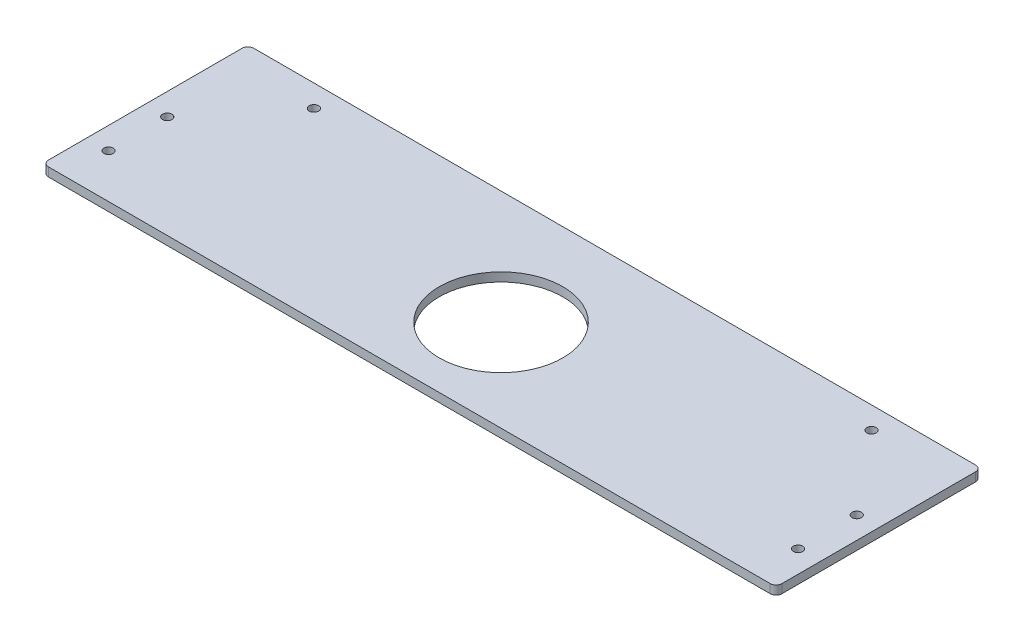
ISO-10303-21;
HEADER;
FILE_DESCRIPTION(('STEP AP214'),'2;1');
FILE_NAME('part.step','',(''),(''),'','','');
FILE_SCHEMA(('AUTOMOTIVE_DESIGN { 1 0 10303 214 1 1 1 1 }'));
ENDSEC;
DATA;
#1=APPLICATION_CONTEXT('core data for automotive mechanical design processes');
#2=APPLICATION_PROTOCOL_DEFINITION('international standard','automotive_design',2000,#1);
#3=PRODUCT_CONTEXT('',#1,'mechanical');
#4=PRODUCT('Part','Part','',(#3));
#5=PRODUCT_RELATED_PRODUCT_CATEGORY('part','',(#4));
#6=PRODUCT_DEFINITION_FORMATION('','',#4);
#7=PRODUCT_DEFINITION_CONTEXT('part definition',#1,'design');
#8=PRODUCT_DEFINITION('design','',#6,#7);
#9=PRODUCT_DEFINITION_SHAPE('','',#8);
#10=(LENGTH_UNIT() NAMED_UNIT(*) SI_UNIT(.MILLI.,.METRE.));
#11=(NAMED_UNIT(*) PLANE_ANGLE_UNIT() SI_UNIT($,.RADIAN.));
#12=(NAMED_UNIT(*) SI_UNIT($,.STERADIAN.) SOLID_ANGLE_UNIT());
#13=UNCERTAINTY_MEASURE_WITH_UNIT(LENGTH_MEASURE(1.E-05),#10,'distance_accuracy_value','');
#14=(GEOMETRIC_REPRESENTATION_CONTEXT(3) GLOBAL_UNCERTAINTY_ASSIGNED_CONTEXT((#13)) GLOBAL_UNIT_ASSIGNED_CONTEXT((#10,
#11,#12)) REPRESENTATION_CONTEXT('',''));
#15=CARTESIAN_POINT('',(0.,0.,0.));
#16=DIRECTION('',(0.,0.,1.));
#17=DIRECTION('',(1.,0.,0.));
#18=AXIS2_PLACEMENT_3D('',#15,#16,#17);
#19=CARTESIAN_POINT('',(125.,3.,35.));
#20=DIRECTION('',(-1.,0.,0.));
#21=DIRECTION('',(0.,0.,1.));
#22=AXIS2_PLACEMENT_3D('',#19,#20,#21);
#23=PLANE('',#22);
#24=DIRECTION('',(0.,0.,-1.));
#25=VECTOR('',#24,1.);
#26=CARTESIAN_POINT('',(125.,3.,35.));
#27=LINE('',#26,#25);
#28=CARTESIAN_POINT('',(125.,3.,33.));
#29=VERTEX_POINT('',#28);
#30=CARTESIAN_POINT('',(125.,3.,-33.));
#31=VERTEX_POINT('',#30);
#32=EDGE_CURVE('E125',#29,#31,#27,.T.);
#33=ORIENTED_EDGE('',*,*,#32,.F.);
#34=DIRECTION('',(0.,-1.,0.));
#35=VECTOR('',#34,1.);
#36=CARTESIAN_POINT('',(125.,3.,33.));
#37=LINE('',#36,#35);
#38=CARTESIAN_POINT('',(125.,0.,33.));
#39=VERTEX_POINT('',#38);
#40=EDGE_CURVE('E110',#29,#39,#37,.T.);
#41=ORIENTED_EDGE('',*,*,#40,.T.);
#42=DIRECTION('',(0.,0.,-1.));
#43=VECTOR('',#42,1.);
#44=CARTESIAN_POINT('',(125.,0.,35.));
#45=LINE('',#44,#43);
#46=CARTESIAN_POINT('',(125.,0.,-33.));
#47=VERTEX_POINT('',#46);
#48=EDGE_CURVE('E122',#39,#47,#45,.T.);
#49=ORIENTED_EDGE('',*,*,#48,.T.);
#50=DIRECTION('',(0.,-1.,0.));
#51=VECTOR('',#50,1.);
#52=CARTESIAN_POINT('',(125.,3.,-33.));
#53=LINE('',#52,#51);
#54=EDGE_CURVE('E127',#47,#31,#53,.F.);
#55=ORIENTED_EDGE('',*,*,#54,.T.);
#56=EDGE_LOOP('',(#33,#41,#49,#55));
#57=FACE_BOUND('',#56,.T.);
#58=ADVANCED_FACE('F41',(#57),#23,.F.);
#59=CARTESIAN_POINT('',(-125.,3.,-35.));
#60=DIRECTION('',(0.,0.,1.));
#61=DIRECTION('',(1.,0.,0.));
#62=AXIS2_PLACEMENT_3D('',#59,#60,#61);
#63=PLANE('',#62);
#64=DIRECTION('',(-1.,0.,0.));
#65=VECTOR('',#64,1.);
#66=CARTESIAN_POINT('',(-125.,3.,-35.));
#67=LINE('',#66,#65);
#68=CARTESIAN_POINT('',(123.,3.,-35.));
#69=VERTEX_POINT('',#68);
#70=CARTESIAN_POINT('',(-123.,3.,-35.));
#71=VERTEX_POINT('',#70);
#72=EDGE_CURVE('E180',#69,#71,#67,.T.);
#73=ORIENTED_EDGE('',*,*,#72,.F.);
#74=DIRECTION('',(0.,-1.,0.));
#75=VECTOR('',#74,1.);
#76=CARTESIAN_POINT('',(123.,3.,-35.));
#77=LINE('',#76,#75);
#78=CARTESIAN_POINT('',(123.,0.,-35.));
#79=VERTEX_POINT('',#78);
#80=EDGE_CURVE('E164',#69,#79,#77,.T.);
#81=ORIENTED_EDGE('',*,*,#80,.T.);
#82=DIRECTION('',(-1.,0.,0.));
#83=VECTOR('',#82,1.);
#84=CARTESIAN_POINT('',(-125.,0.,-35.));
#85=LINE('',#84,#83);
#86=CARTESIAN_POINT('',(-123.,0.,-35.));
#87=VERTEX_POINT('',#86);
#88=EDGE_CURVE('E131',#79,#87,#85,.T.);
#89=ORIENTED_EDGE('',*,*,#88,.T.);
#90=DIRECTION('',(0.,-1.,0.));
#91=VECTOR('',#90,1.);
#92=CARTESIAN_POINT('',(-123.,3.,-35.));
#93=LINE('',#92,#91);
#94=EDGE_CURVE('E162',#87,#71,#93,.F.);
#95=ORIENTED_EDGE('',*,*,#94,.T.);
#96=EDGE_LOOP('',(#73,#81,#89,#95));
#97=FACE_BOUND('',#96,.T.);
#98=ADVANCED_FACE('F263',(#97),#63,.F.);
#99=CARTESIAN_POINT('',(-125.,3.,35.));
#100=DIRECTION('',(1.,0.,0.));
#101=DIRECTION('',(0.,0.,-1.));
#102=AXIS2_PLACEMENT_3D('',#99,#100,#101);
#103=PLANE('',#102);
#104=DIRECTION('',(0.,0.,1.));
#105=VECTOR('',#104,1.);
#106=CARTESIAN_POINT('',(-125.,0.,35.));
#107=LINE('',#106,#105);
#108=CARTESIAN_POINT('',(-125.,0.,-33.));
#109=VERTEX_POINT('',#108);
#110=CARTESIAN_POINT('',(-125.,0.,33.));
#111=VERTEX_POINT('',#110);
#112=EDGE_CURVE('E135',#109,#111,#107,.T.);
#113=ORIENTED_EDGE('',*,*,#112,.T.);
#114=DIRECTION('',(0.,-1.,0.));
#115=VECTOR('',#114,1.);
#116=CARTESIAN_POINT('',(-125.,3.,33.));
#117=LINE('',#116,#115);
#118=CARTESIAN_POINT('',(-125.,3.,33.));
#119=VERTEX_POINT('',#118);
#120=EDGE_CURVE('E11',#111,#119,#117,.F.);
#121=ORIENTED_EDGE('',*,*,#120,.T.);
#122=DIRECTION('',(0.,0.,1.));
#123=VECTOR('',#122,1.);
#124=CARTESIAN_POINT('',(-125.,3.,35.));
#125=LINE('',#124,#123);
#126=CARTESIAN_POINT('',(-125.,3.,-33.));
#127=VERTEX_POINT('',#126);
#128=EDGE_CURVE('E170',#127,#119,#125,.T.);
#129=ORIENTED_EDGE('',*,*,#128,.F.);
#130=DIRECTION('',(0.,-1.,0.));
#131=VECTOR('',#130,1.);
#132=CARTESIAN_POINT('',(-125.,3.,-33.));
#133=LINE('',#132,#131);
#134=EDGE_CURVE('E49',#127,#109,#133,.T.);
#135=ORIENTED_EDGE('',*,*,#134,.T.);
#136=EDGE_LOOP('',(#113,#121,#129,#135));
#137=FACE_BOUND('',#136,.T.);
#138=ADVANCED_FACE('F169',(#137),#103,.F.);
#139=CARTESIAN_POINT('',(-125.,3.,35.));
#140=DIRECTION('',(0.,0.,-1.));
#141=DIRECTION('',(-1.,0.,0.));
#142=AXIS2_PLACEMENT_3D('',#139,#140,#141);
#143=PLANE('',#142);
#144=DIRECTION('',(1.,0.,0.));
#145=VECTOR('',#144,1.);
#146=CARTESIAN_POINT('',(-125.,0.,35.));
#147=LINE('',#146,#145);
#148=CARTESIAN_POINT('',(-123.,0.,35.));
#149=VERTEX_POINT('',#148);
#150=CARTESIAN_POINT('',(123.,0.,35.));
#151=VERTEX_POINT('',#150);
#152=EDGE_CURVE('E145',#149,#151,#147,.T.);
#153=ORIENTED_EDGE('',*,*,#152,.T.);
#154=DIRECTION('',(0.,-1.,0.));
#155=VECTOR('',#154,1.);
#156=CARTESIAN_POINT('',(123.,3.,35.));
#157=LINE('',#156,#155);
#158=CARTESIAN_POINT('',(123.,3.,35.));
#159=VERTEX_POINT('',#158);
#160=EDGE_CURVE('E111',#151,#159,#157,.F.);
#161=ORIENTED_EDGE('',*,*,#160,.T.);
#162=DIRECTION('',(1.,0.,0.));
#163=VECTOR('',#162,1.);
#164=CARTESIAN_POINT('',(-125.,3.,35.));
#165=LINE('',#164,#163);
#166=CARTESIAN_POINT('',(-123.,3.,35.));
#167=VERTEX_POINT('',#166);
#168=EDGE_CURVE('E141',#167,#159,#165,.T.);
#169=ORIENTED_EDGE('',*,*,#168,.F.);
#170=DIRECTION('',(0.,-1.,0.));
#171=VECTOR('',#170,1.);
#172=CARTESIAN_POINT('',(-123.,3.,35.));
#173=LINE('',#172,#171);
#174=EDGE_CURVE('E116',#167,#149,#173,.T.);
#175=ORIENTED_EDGE('',*,*,#174,.T.);
#176=EDGE_LOOP('',(#153,#161,#169,#175));
#177=FACE_BOUND('',#176,.T.);
#178=ADVANCED_FACE('F178',(#177),#143,.F.);
#179=CARTESIAN_POINT('',(0.,3.,0.));
#180=DIRECTION('',(0.,-1.,0.));
#181=DIRECTION('',(0.,0.,-1.));
#182=AXIS2_PLACEMENT_3D('',#179,#180,#181);
#183=PLANE('',#182);
#184=CARTESIAN_POINT('',(0.,3.,3.74999999999998));
#185=DIRECTION('',(0.,1.,0.));
#186=DIRECTION('',(0.,0.,1.));
#187=AXIS2_PLACEMENT_3D('',#184,#185,#186);
#188=CIRCLE('',#187,21.05);
#189=CARTESIAN_POINT('',(0.,3.,24.8));
#190=VERTEX_POINT('',#189);
#191=EDGE_CURVE('E217',#190,#190,#188,.T.);
#192=ORIENTED_EDGE('',*,*,#191,.F.);
#193=EDGE_LOOP('',(#192));
#194=FACE_BOUND('',#193,.T.);
#195=CARTESIAN_POINT('',(95.,3.,-27.5));
#196=DIRECTION('',(0.,1.,0.));
#197=DIRECTION('',(0.,0.,1.));
#198=AXIS2_PLACEMENT_3D('',#195,#196,#197);
#199=CIRCLE('',#198,1.6);
#200=CARTESIAN_POINT('',(95.,3.,-25.9));
#201=VERTEX_POINT('',#200);
#202=EDGE_CURVE('E185',#201,#201,#199,.T.);
#203=ORIENTED_EDGE('',*,*,#202,.F.);
#204=EDGE_LOOP('',(#203));
#205=FACE_BOUND('',#204,.T.);
#206=CARTESIAN_POINT('',(-117.5,3.,0.));
#207=DIRECTION('',(0.,1.,0.));
#208=DIRECTION('',(0.,0.,1.));
#209=AXIS2_PLACEMENT_3D('',#206,#207,#208);
#210=CIRCLE('',#209,1.60000000000001);
#211=CARTESIAN_POINT('',(-117.5,3.,1.60000000000001));
#212=VERTEX_POINT('',#211);
#213=EDGE_CURVE('E203',#212,#212,#210,.T.);
#214=ORIENTED_EDGE('',*,*,#213,.F.);
#215=EDGE_LOOP('',(#214));
#216=FACE_BOUND('',#215,.T.);
#217=CARTESIAN_POINT('',(-117.5,3.,20.));
#218=DIRECTION('',(0.,1.,0.));
#219=DIRECTION('',(0.,0.,1.));
#220=AXIS2_PLACEMENT_3D('',#217,#218,#219);
#221=CIRCLE('',#220,1.6);
#222=CARTESIAN_POINT('',(-117.5,3.,21.6));
#223=VERTEX_POINT('',#222);
#224=EDGE_CURVE('E197',#223,#223,#221,.T.);
#225=ORIENTED_EDGE('',*,*,#224,.F.);
#226=EDGE_LOOP('',(#225));
#227=FACE_BOUND('',#226,.T.);
#228=CARTESIAN_POINT('',(117.5,3.,20.));
#229=DIRECTION('',(0.,1.,0.));
#230=DIRECTION('',(0.,0.,-1.));
#231=AXIS2_PLACEMENT_3D('',#228,#229,#230);
#232=CIRCLE('',#231,1.6);
#233=CARTESIAN_POINT('',(117.5,3.,18.4));
#234=VERTEX_POINT('',#233);
#235=EDGE_CURVE('E190',#234,#234,#232,.T.);
#236=ORIENTED_EDGE('',*,*,#235,.F.);
#237=EDGE_LOOP('',(#236));
#238=FACE_BOUND('',#237,.T.);
#239=CARTESIAN_POINT('',(117.5,3.,0.));
#240=DIRECTION('',(0.,1.,0.));
#241=DIRECTION('',(0.,0.,-1.));
#242=AXIS2_PLACEMENT_3D('',#239,#240,#241);
#243=CIRCLE('',#242,1.60000000000001);
#244=CARTESIAN_POINT('',(117.5,3.,-1.60000000000003));
#245=VERTEX_POINT('',#244);
#246=EDGE_CURVE('E191',#245,#245,#243,.T.);
#247=ORIENTED_EDGE('',*,*,#246,.F.);
#248=EDGE_LOOP('',(#247));
#249=FACE_BOUND('',#248,.T.);
#250=CARTESIAN_POINT('',(-95.,3.,-27.5));
#251=DIRECTION('',(0.,1.,0.));
#252=DIRECTION('',(0.,0.,1.));
#253=AXIS2_PLACEMENT_3D('',#250,#251,#252);
#254=CIRCLE('',#253,1.6);
#255=CARTESIAN_POINT('',(-95.,3.,-25.9));
#256=VERTEX_POINT('',#255);
#257=EDGE_CURVE('E138',#256,#256,#254,.T.);
#258=ORIENTED_EDGE('',*,*,#257,.F.);
#259=EDGE_LOOP('',(#258));
#260=FACE_BOUND('',#259,.T.);
#261=ORIENTED_EDGE('',*,*,#168,.T.);
#262=CARTESIAN_POINT('',(123.,3.,33.));
#263=DIRECTION('',(0.,-1.,0.));
#264=DIRECTION('',(0.,0.,-1.));
#265=AXIS2_PLACEMENT_3D('',#262,#263,#264);
#266=CIRCLE('',#265,2.);
#267=EDGE_CURVE('E160',#159,#29,#266,.F.);
#268=ORIENTED_EDGE('',*,*,#267,.T.);
#269=ORIENTED_EDGE('',*,*,#32,.T.);
#270=CARTESIAN_POINT('',(123.,3.,-33.));
#271=DIRECTION('',(0.,-1.,0.));
#272=DIRECTION('',(0.,0.,-1.));
#273=AXIS2_PLACEMENT_3D('',#270,#271,#272);
#274=CIRCLE('',#273,2.);
#275=EDGE_CURVE('E158',#31,#69,#274,.F.);
#276=ORIENTED_EDGE('',*,*,#275,.T.);
#277=ORIENTED_EDGE('',*,*,#72,.T.);
#278=CARTESIAN_POINT('',(-123.,3.,-33.));
#279=DIRECTION('',(0.,-1.,0.));
#280=DIRECTION('',(0.,0.,-1.));
#281=AXIS2_PLACEMENT_3D('',#278,#279,#280);
#282=CIRCLE('',#281,2.);
#283=EDGE_CURVE('E61',#71,#127,#282,.F.);
#284=ORIENTED_EDGE('',*,*,#283,.T.);
#285=ORIENTED_EDGE('',*,*,#128,.T.);
#286=CARTESIAN_POINT('',(-123.,3.,33.));
#287=DIRECTION('',(0.,-1.,0.));
#288=DIRECTION('',(0.,0.,-1.));
#289=AXIS2_PLACEMENT_3D('',#286,#287,#288);
#290=CIRCLE('',#289,2.);
#291=EDGE_CURVE('E156',#119,#167,#290,.F.);
#292=ORIENTED_EDGE('',*,*,#291,.T.);
#293=EDGE_LOOP('',(#261,#268,#269,#276,#277,#284,#285,#292));
#294=FACE_BOUND('',#293,.T.);
#295=ADVANCED_FACE('F231',(#194,#205,#216,#227,#238,#249,#260,#294),#183,.F.);
#296=CARTESIAN_POINT('',(0.,0.,0.));
#297=DIRECTION('',(0.,-1.,0.));
#298=DIRECTION('',(0.,0.,-1.));
#299=AXIS2_PLACEMENT_3D('',#296,#297,#298);
#300=PLANE('',#299);
#301=CARTESIAN_POINT('',(0.,0.,3.74999999999998));
#302=DIRECTION('',(0.,1.,0.));
#303=DIRECTION('',(0.,0.,1.));
#304=AXIS2_PLACEMENT_3D('',#301,#302,#303);
#305=CIRCLE('',#304,21.05);
#306=CARTESIAN_POINT('',(0.,0.,24.8));
#307=VERTEX_POINT('',#306);
#308=EDGE_CURVE('E214',#307,#307,#305,.T.);
#309=ORIENTED_EDGE('',*,*,#308,.T.);
#310=EDGE_LOOP('',(#309));
#311=FACE_BOUND('',#310,.T.);
#312=CARTESIAN_POINT('',(95.,0.,-27.5));
#313=DIRECTION('',(0.,1.,0.));
#314=DIRECTION('',(0.,0.,1.));
#315=AXIS2_PLACEMENT_3D('',#312,#313,#314);
#316=CIRCLE('',#315,1.6);
#317=CARTESIAN_POINT('',(95.,0.,-25.9));
#318=VERTEX_POINT('',#317);
#319=EDGE_CURVE('E206',#318,#318,#316,.T.);
#320=ORIENTED_EDGE('',*,*,#319,.T.);
#321=EDGE_LOOP('',(#320));
#322=FACE_BOUND('',#321,.T.);
#323=CARTESIAN_POINT('',(-117.5,0.,0.));
#324=DIRECTION('',(0.,1.,0.));
#325=DIRECTION('',(0.,0.,1.));
#326=AXIS2_PLACEMENT_3D('',#323,#324,#325);
#327=CIRCLE('',#326,1.60000000000001);
#328=CARTESIAN_POINT('',(-117.5,0.,1.60000000000001));
#329=VERTEX_POINT('',#328);
#330=EDGE_CURVE('E200',#329,#329,#327,.T.);
#331=ORIENTED_EDGE('',*,*,#330,.T.);
#332=EDGE_LOOP('',(#331));
#333=FACE_BOUND('',#332,.T.);
#334=CARTESIAN_POINT('',(-117.5,0.,20.));
#335=DIRECTION('',(0.,1.,0.));
#336=DIRECTION('',(0.,0.,1.));
#337=AXIS2_PLACEMENT_3D('',#334,#335,#336);
#338=CIRCLE('',#337,1.6);
#339=CARTESIAN_POINT('',(-117.5,0.,21.6));
#340=VERTEX_POINT('',#339);
#341=EDGE_CURVE('E194',#340,#340,#338,.T.);
#342=ORIENTED_EDGE('',*,*,#341,.T.);
#343=EDGE_LOOP('',(#342));
#344=FACE_BOUND('',#343,.T.);
#345=CARTESIAN_POINT('',(117.5,0.,20.));
#346=DIRECTION('',(0.,1.,0.));
#347=DIRECTION('',(0.,0.,-1.));
#348=AXIS2_PLACEMENT_3D('',#345,#346,#347);
#349=CIRCLE('',#348,1.6);
#350=CARTESIAN_POINT('',(117.5,0.,18.4));
#351=VERTEX_POINT('',#350);
#352=EDGE_CURVE('E187',#351,#351,#349,.T.);
#353=ORIENTED_EDGE('',*,*,#352,.T.);
#354=EDGE_LOOP('',(#353));
#355=FACE_BOUND('',#354,.T.);
#356=CARTESIAN_POINT('',(117.5,0.,0.));
#357=DIRECTION('',(0.,1.,0.));
#358=DIRECTION('',(0.,0.,-1.));
#359=AXIS2_PLACEMENT_3D('',#356,#357,#358);
#360=CIRCLE('',#359,1.60000000000001);
#361=CARTESIAN_POINT('',(117.5,0.,-1.60000000000003));
#362=VERTEX_POINT('',#361);
#363=EDGE_CURVE('E211',#362,#362,#360,.T.);
#364=ORIENTED_EDGE('',*,*,#363,.T.);
#365=EDGE_LOOP('',(#364));
#366=FACE_BOUND('',#365,.T.);
#367=CARTESIAN_POINT('',(-95.,0.,-27.5));
#368=DIRECTION('',(0.,1.,0.));
#369=DIRECTION('',(0.,0.,1.));
#370=AXIS2_PLACEMENT_3D('',#367,#368,#369);
#371=CIRCLE('',#370,1.6);
#372=CARTESIAN_POINT('',(-95.,0.,-25.9));
#373=VERTEX_POINT('',#372);
#374=EDGE_CURVE('E132',#373,#373,#371,.T.);
#375=ORIENTED_EDGE('',*,*,#374,.T.);
#376=EDGE_LOOP('',(#375));
#377=FACE_BOUND('',#376,.T.);
#378=ORIENTED_EDGE('',*,*,#48,.F.);
#379=CARTESIAN_POINT('',(123.,0.,33.));
#380=DIRECTION('',(0.,-1.,0.));
#381=DIRECTION('',(0.,0.,-1.));
#382=AXIS2_PLACEMENT_3D('',#379,#380,#381);
#383=CIRCLE('',#382,2.);
#384=EDGE_CURVE('E106',#39,#151,#383,.T.);
#385=ORIENTED_EDGE('',*,*,#384,.T.);
#386=ORIENTED_EDGE('',*,*,#152,.F.);
#387=CARTESIAN_POINT('',(-123.,0.,33.));
#388=DIRECTION('',(0.,-1.,0.));
#389=DIRECTION('',(0.,0.,-1.));
#390=AXIS2_PLACEMENT_3D('',#387,#388,#389);
#391=CIRCLE('',#390,2.);
#392=EDGE_CURVE('E149',#149,#111,#391,.T.);
#393=ORIENTED_EDGE('',*,*,#392,.T.);
#394=ORIENTED_EDGE('',*,*,#112,.F.);
#395=CARTESIAN_POINT('',(-123.,0.,-33.));
#396=DIRECTION('',(0.,-1.,0.));
#397=DIRECTION('',(0.,0.,-1.));
#398=AXIS2_PLACEMENT_3D('',#395,#396,#397);
#399=CIRCLE('',#398,2.);
#400=EDGE_CURVE('E126',#109,#87,#399,.T.);
#401=ORIENTED_EDGE('',*,*,#400,.T.);
#402=ORIENTED_EDGE('',*,*,#88,.F.);
#403=CARTESIAN_POINT('',(123.,0.,-33.));
#404=DIRECTION('',(0.,-1.,0.));
#405=DIRECTION('',(0.,0.,-1.));
#406=AXIS2_PLACEMENT_3D('',#403,#404,#405);
#407=CIRCLE('',#406,2.);
#408=EDGE_CURVE('E117',#79,#47,#407,.T.);
#409=ORIENTED_EDGE('',*,*,#408,.T.);
#410=EDGE_LOOP('',(#378,#385,#386,#393,#394,#401,#402,#409));
#411=FACE_BOUND('',#410,.T.);
#412=ADVANCED_FACE('F129',(#311,#322,#333,#344,#355,#366,#377,#411),#300,.T.);
#413=CARTESIAN_POINT('',(-95.,0.,-27.5));
#414=DIRECTION('',(0.,1.,0.));
#415=DIRECTION('',(0.,0.,1.));
#416=AXIS2_PLACEMENT_3D('',#413,#414,#415);
#417=CYLINDRICAL_SURFACE('',#416,1.6);
#418=ORIENTED_EDGE('',*,*,#374,.F.);
#419=EDGE_LOOP('',(#418));
#420=FACE_BOUND('',#419,.T.);
#421=ORIENTED_EDGE('',*,*,#257,.T.);
#422=EDGE_LOOP('',(#421));
#423=FACE_BOUND('',#422,.T.);
#424=ADVANCED_FACE('F247',(#420,#423),#417,.F.);
#425=CARTESIAN_POINT('',(117.5,0.,0.));
#426=DIRECTION('',(0.,1.,0.));
#427=DIRECTION('',(0.,0.,1.));
#428=AXIS2_PLACEMENT_3D('',#425,#426,#427);
#429=CYLINDRICAL_SURFACE('',#428,1.60000000000001);
#430=ORIENTED_EDGE('',*,*,#363,.F.);
#431=EDGE_LOOP('',(#430));
#432=FACE_BOUND('',#431,.T.);
#433=ORIENTED_EDGE('',*,*,#246,.T.);
#434=EDGE_LOOP('',(#433));
#435=FACE_BOUND('',#434,.T.);
#436=ADVANCED_FACE('F249',(#432,#435),#429,.F.);
#437=CARTESIAN_POINT('',(117.5,0.,20.));
#438=DIRECTION('',(0.,1.,0.));
#439=DIRECTION('',(0.,0.,1.));
#440=AXIS2_PLACEMENT_3D('',#437,#438,#439);
#441=CYLINDRICAL_SURFACE('',#440,1.6);
#442=ORIENTED_EDGE('',*,*,#352,.F.);
#443=EDGE_LOOP('',(#442));
#444=FACE_BOUND('',#443,.T.);
#445=ORIENTED_EDGE('',*,*,#235,.T.);
#446=EDGE_LOOP('',(#445));
#447=FACE_BOUND('',#446,.T.);
#448=ADVANCED_FACE('F255',(#444,#447),#441,.F.);
#449=CARTESIAN_POINT('',(-117.5,0.,20.));
#450=DIRECTION('',(0.,1.,0.));
#451=DIRECTION('',(0.,0.,1.));
#452=AXIS2_PLACEMENT_3D('',#449,#450,#451);
#453=CYLINDRICAL_SURFACE('',#452,1.6);
#454=ORIENTED_EDGE('',*,*,#341,.F.);
#455=EDGE_LOOP('',(#454));
#456=FACE_BOUND('',#455,.T.);
#457=ORIENTED_EDGE('',*,*,#224,.T.);
#458=EDGE_LOOP('',(#457));
#459=FACE_BOUND('',#458,.T.);
#460=ADVANCED_FACE('F337',(#456,#459),#453,.F.);
#461=CARTESIAN_POINT('',(-117.5,0.,0.));
#462=DIRECTION('',(0.,1.,0.));
#463=DIRECTION('',(0.,0.,1.));
#464=AXIS2_PLACEMENT_3D('',#461,#462,#463);
#465=CYLINDRICAL_SURFACE('',#464,1.60000000000001);
#466=ORIENTED_EDGE('',*,*,#330,.F.);
#467=EDGE_LOOP('',(#466));
#468=FACE_BOUND('',#467,.T.);
#469=ORIENTED_EDGE('',*,*,#213,.T.);
#470=EDGE_LOOP('',(#469));
#471=FACE_BOUND('',#470,.T.);
#472=ADVANCED_FACE('F328',(#468,#471),#465,.F.);
#473=CARTESIAN_POINT('',(95.,0.,-27.5));
#474=DIRECTION('',(0.,1.,0.));
#475=DIRECTION('',(0.,0.,1.));
#476=AXIS2_PLACEMENT_3D('',#473,#474,#475);
#477=CYLINDRICAL_SURFACE('',#476,1.6);
#478=ORIENTED_EDGE('',*,*,#319,.F.);
#479=EDGE_LOOP('',(#478));
#480=FACE_BOUND('',#479,.T.);
#481=ORIENTED_EDGE('',*,*,#202,.T.);
#482=EDGE_LOOP('',(#481));
#483=FACE_BOUND('',#482,.T.);
#484=ADVANCED_FACE('F276',(#480,#483),#477,.F.);
#485=CARTESIAN_POINT('',(123.,3.,33.));
#486=DIRECTION('',(0.,-1.,0.));
#487=DIRECTION('',(0.,0.,-1.));
#488=AXIS2_PLACEMENT_3D('',#485,#486,#487);
#489=CYLINDRICAL_SURFACE('',#488,2.);
#490=ORIENTED_EDGE('',*,*,#267,.F.);
#491=ORIENTED_EDGE('',*,*,#160,.F.);
#492=ORIENTED_EDGE('',*,*,#384,.F.);
#493=ORIENTED_EDGE('',*,*,#40,.F.);
#494=EDGE_LOOP('',(#490,#491,#492,#493));
#495=FACE_BOUND('',#494,.T.);
#496=ADVANCED_FACE('F109',(#495),#489,.T.);
#497=CARTESIAN_POINT('',(123.,3.,-33.));
#498=DIRECTION('',(0.,-1.,0.));
#499=DIRECTION('',(0.,0.,-1.));
#500=AXIS2_PLACEMENT_3D('',#497,#498,#499);
#501=CYLINDRICAL_SURFACE('',#500,2.);
#502=ORIENTED_EDGE('',*,*,#275,.F.);
#503=ORIENTED_EDGE('',*,*,#54,.F.);
#504=ORIENTED_EDGE('',*,*,#408,.F.);
#505=ORIENTED_EDGE('',*,*,#80,.F.);
#506=EDGE_LOOP('',(#502,#503,#504,#505));
#507=FACE_BOUND('',#506,.T.);
#508=ADVANCED_FACE('F275',(#507),#501,.T.);
#509=CARTESIAN_POINT('',(-123.,3.,33.));
#510=DIRECTION('',(0.,-1.,0.));
#511=DIRECTION('',(0.,0.,-1.));
#512=AXIS2_PLACEMENT_3D('',#509,#510,#511);
#513=CYLINDRICAL_SURFACE('',#512,2.);
#514=ORIENTED_EDGE('',*,*,#291,.F.);
#515=ORIENTED_EDGE('',*,*,#120,.F.);
#516=ORIENTED_EDGE('',*,*,#392,.F.);
#517=ORIENTED_EDGE('',*,*,#174,.F.);
#518=EDGE_LOOP('',(#514,#515,#516,#517));
#519=FACE_BOUND('',#518,.T.);
#520=ADVANCED_FACE('F175',(#519),#513,.T.);
#521=CARTESIAN_POINT('',(-123.,3.,-33.));
#522=DIRECTION('',(0.,-1.,0.));
#523=DIRECTION('',(0.,0.,-1.));
#524=AXIS2_PLACEMENT_3D('',#521,#522,#523);
#525=CYLINDRICAL_SURFACE('',#524,2.);
#526=ORIENTED_EDGE('',*,*,#283,.F.);
#527=ORIENTED_EDGE('',*,*,#94,.F.);
#528=ORIENTED_EDGE('',*,*,#400,.F.);
#529=ORIENTED_EDGE('',*,*,#134,.F.);
#530=EDGE_LOOP('',(#526,#527,#528,#529));
#531=FACE_BOUND('',#530,.T.);
#532=ADVANCED_FACE('F43',(#531),#525,.T.);
#533=CARTESIAN_POINT('',(0.,0.,3.74999999999998));
#534=DIRECTION('',(0.,1.,0.));
#535=DIRECTION('',(0.,0.,1.));
#536=AXIS2_PLACEMENT_3D('',#533,#534,#535);
#537=CYLINDRICAL_SURFACE('',#536,21.05);
#538=ORIENTED_EDGE('',*,*,#308,.F.);
#539=EDGE_LOOP('',(#538));
#540=FACE_BOUND('',#539,.T.);
#541=ORIENTED_EDGE('',*,*,#191,.T.);
#542=EDGE_LOOP('',(#541));
#543=FACE_BOUND('',#542,.T.);
#544=ADVANCED_FACE('F225',(#540,#543),#537,.F.);
#545=CLOSED_SHELL('',(#58,#98,#138,#178,#295,#412,#424,#436,#448,#460,#472,#484,#496,#508,#520,
#532,#544));
#546=MANIFOLD_SOLID_BREP('B2',#545);
#547=ADVANCED_BREP_SHAPE_REPRESENTATION('',(#18,#546),#14);
#548=SHAPE_DEFINITION_REPRESENTATION(#9,#547);
ENDSEC;
END-ISO-10303-21;
